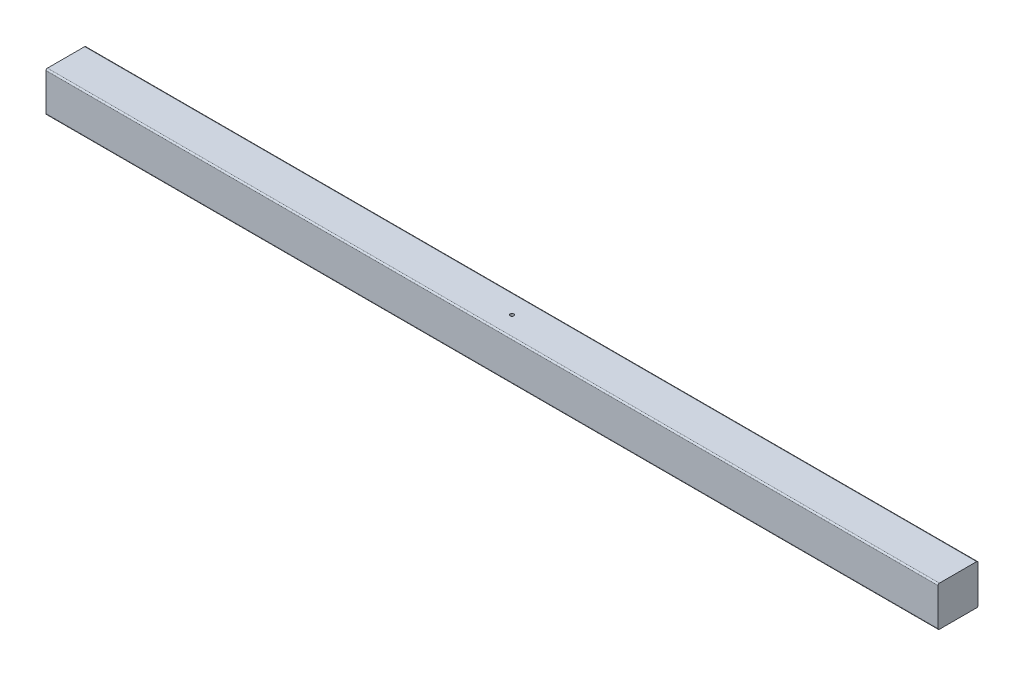
ISO-10303-21;
HEADER;
FILE_DESCRIPTION(('STEP AP214'),'2;1');
FILE_NAME('part.step','',(''),(''),'','','');
FILE_SCHEMA(('AUTOMOTIVE_DESIGN { 1 0 10303 214 1 1 1 1 }'));
ENDSEC;
DATA;
#1=APPLICATION_CONTEXT('core data for automotive mechanical design processes');
#2=APPLICATION_PROTOCOL_DEFINITION('international standard','automotive_design',2000,#1);
#3=PRODUCT_CONTEXT('',#1,'mechanical');
#4=PRODUCT('Part','Part','',(#3));
#5=PRODUCT_RELATED_PRODUCT_CATEGORY('part','',(#4));
#6=PRODUCT_DEFINITION_FORMATION('','',#4);
#7=PRODUCT_DEFINITION_CONTEXT('part definition',#1,'design');
#8=PRODUCT_DEFINITION('design','',#6,#7);
#9=PRODUCT_DEFINITION_SHAPE('','',#8);
#10=(LENGTH_UNIT() NAMED_UNIT(*) SI_UNIT(.MILLI.,.METRE.));
#11=(NAMED_UNIT(*) PLANE_ANGLE_UNIT() SI_UNIT($,.RADIAN.));
#12=(NAMED_UNIT(*) SI_UNIT($,.STERADIAN.) SOLID_ANGLE_UNIT());
#13=UNCERTAINTY_MEASURE_WITH_UNIT(LENGTH_MEASURE(1.E-05),#10,'distance_accuracy_value','');
#14=(GEOMETRIC_REPRESENTATION_CONTEXT(3) GLOBAL_UNCERTAINTY_ASSIGNED_CONTEXT((#13)) GLOBAL_UNIT_ASSIGNED_CONTEXT((#10,
#11,#12)) REPRESENTATION_CONTEXT('',''));
#15=CARTESIAN_POINT('',(0.,0.,0.));
#16=DIRECTION('',(0.,0.,1.));
#17=DIRECTION('',(1.,0.,0.));
#18=AXIS2_PLACEMENT_3D('',#15,#16,#17);
#19=CARTESIAN_POINT('',(1981.2,-44.45,-44.45));
#20=DIRECTION('',(0.,0.,1.));
#21=DIRECTION('',(1.,0.,0.));
#22=AXIS2_PLACEMENT_3D('',#19,#20,#21);
#23=PLANE('',#22);
#24=DIRECTION('',(0.,1.,0.));
#25=VECTOR('',#24,1.);
#26=CARTESIAN_POINT('',(1981.2,-44.45,-44.45));
#27=LINE('',#26,#25);
#28=CARTESIAN_POINT('',(1981.2,-41.275,-44.45));
#29=VERTEX_POINT('',#28);
#30=CARTESIAN_POINT('',(1981.2,41.275,-44.45));
#31=VERTEX_POINT('',#30);
#32=EDGE_CURVE('E117',#29,#31,#27,.T.);
#33=ORIENTED_EDGE('',*,*,#32,.F.);
#34=DIRECTION('',(-1.,0.,0.));
#35=VECTOR('',#34,1.);
#36=CARTESIAN_POINT('',(1981.2,-41.275,-44.45));
#37=LINE('',#36,#35);
#38=CARTESIAN_POINT('',(0.,-41.275,-44.45));
#39=VERTEX_POINT('',#38);
#40=EDGE_CURVE('E102',#29,#39,#37,.T.);
#41=ORIENTED_EDGE('',*,*,#40,.T.);
#42=DIRECTION('',(0.,1.,0.));
#43=VECTOR('',#42,1.);
#44=CARTESIAN_POINT('',(0.,-44.45,-44.45));
#45=LINE('',#44,#43);
#46=CARTESIAN_POINT('',(0.,41.275,-44.45));
#47=VERTEX_POINT('',#46);
#48=EDGE_CURVE('E114',#39,#47,#45,.T.);
#49=ORIENTED_EDGE('',*,*,#48,.T.);
#50=DIRECTION('',(-1.,0.,0.));
#51=VECTOR('',#50,1.);
#52=CARTESIAN_POINT('',(1981.2,41.275,-44.45));
#53=LINE('',#52,#51);
#54=EDGE_CURVE('E119',#47,#31,#53,.F.);
#55=ORIENTED_EDGE('',*,*,#54,.T.);
#56=EDGE_LOOP('',(#33,#41,#49,#55));
#57=FACE_BOUND('',#56,.T.);
#58=ADVANCED_FACE('F33',(#57),#23,.F.);
#59=CARTESIAN_POINT('',(1981.2,44.45,44.45));
#60=DIRECTION('',(0.,-1.,0.));
#61=DIRECTION('',(0.,0.,-1.));
#62=AXIS2_PLACEMENT_3D('',#59,#60,#61);
#63=PLANE('',#62);
#64=CARTESIAN_POINT('',(990.6,44.45,0.));
#65=DIRECTION('',(0.,1.,0.));
#66=DIRECTION('',(0.,0.,1.));
#67=AXIS2_PLACEMENT_3D('',#64,#65,#66);
#68=CIRCLE('',#67,3.96874999999997);
#69=CARTESIAN_POINT('',(990.6,44.45,3.96874999999997));
#70=VERTEX_POINT('',#69);
#71=EDGE_CURVE('E130',#70,#70,#68,.T.);
#72=ORIENTED_EDGE('',*,*,#71,.F.);
#73=EDGE_LOOP('',(#72));
#74=FACE_BOUND('',#73,.T.);
#75=DIRECTION('',(0.,0.,1.));
#76=VECTOR('',#75,1.);
#77=CARTESIAN_POINT('',(1981.2,44.45,44.45));
#78=LINE('',#77,#76);
#79=CARTESIAN_POINT('',(1981.2,44.45,-41.275));
#80=VERTEX_POINT('',#79);
#81=CARTESIAN_POINT('',(1981.2,44.45,41.275));
#82=VERTEX_POINT('',#81);
#83=EDGE_CURVE('E172',#80,#82,#78,.T.);
#84=ORIENTED_EDGE('',*,*,#83,.F.);
#85=DIRECTION('',(-1.,0.,0.));
#86=VECTOR('',#85,1.);
#87=CARTESIAN_POINT('',(1981.2,44.45,-41.275));
#88=LINE('',#87,#86);
#89=CARTESIAN_POINT('',(0.,44.45,-41.275));
#90=VERTEX_POINT('',#89);
#91=EDGE_CURVE('E156',#80,#90,#88,.T.);
#92=ORIENTED_EDGE('',*,*,#91,.T.);
#93=DIRECTION('',(0.,0.,1.));
#94=VECTOR('',#93,1.);
#95=CARTESIAN_POINT('',(0.,44.45,44.45));
#96=LINE('',#95,#94);
#97=CARTESIAN_POINT('',(0.,44.45,41.275));
#98=VERTEX_POINT('',#97);
#99=EDGE_CURVE('E123',#90,#98,#96,.T.);
#100=ORIENTED_EDGE('',*,*,#99,.T.);
#101=DIRECTION('',(-1.,0.,0.));
#102=VECTOR('',#101,1.);
#103=CARTESIAN_POINT('',(1981.2,44.45,41.275));
#104=LINE('',#103,#102);
#105=EDGE_CURVE('E154',#98,#82,#104,.F.);
#106=ORIENTED_EDGE('',*,*,#105,.T.);
#107=EDGE_LOOP('',(#84,#92,#100,#106));
#108=FACE_BOUND('',#107,.T.);
#109=ADVANCED_FACE('F181',(#74,#108),#63,.F.);
#110=CARTESIAN_POINT('',(1981.2,-44.45,44.45));
#111=DIRECTION('',(0.,0.,-1.));
#112=DIRECTION('',(-1.,0.,0.));
#113=AXIS2_PLACEMENT_3D('',#110,#111,#112);
#114=PLANE('',#113);
#115=DIRECTION('',(0.,-1.,0.));
#116=VECTOR('',#115,1.);
#117=CARTESIAN_POINT('',(0.,-44.45,44.45));
#118=LINE('',#117,#116);
#119=CARTESIAN_POINT('',(0.,41.275,44.45));
#120=VERTEX_POINT('',#119);
#121=CARTESIAN_POINT('',(0.,-41.275,44.45));
#122=VERTEX_POINT('',#121);
#123=EDGE_CURVE('E127',#120,#122,#118,.T.);
#124=ORIENTED_EDGE('',*,*,#123,.T.);
#125=DIRECTION('',(-1.,0.,0.));
#126=VECTOR('',#125,1.);
#127=CARTESIAN_POINT('',(1981.2,-41.275,44.45));
#128=LINE('',#127,#126);
#129=CARTESIAN_POINT('',(1981.2,-41.275,44.45));
#130=VERTEX_POINT('',#129);
#131=EDGE_CURVE('E11',#122,#130,#128,.F.);
#132=ORIENTED_EDGE('',*,*,#131,.T.);
#133=DIRECTION('',(0.,-1.,0.));
#134=VECTOR('',#133,1.);
#135=CARTESIAN_POINT('',(1981.2,-44.45,44.45));
#136=LINE('',#135,#134);
#137=CARTESIAN_POINT('',(1981.2,41.275,44.45));
#138=VERTEX_POINT('',#137);
#139=EDGE_CURVE('E162',#138,#130,#136,.T.);
#140=ORIENTED_EDGE('',*,*,#139,.F.);
#141=DIRECTION('',(-1.,0.,0.));
#142=VECTOR('',#141,1.);
#143=CARTESIAN_POINT('',(1981.2,41.275,44.45));
#144=LINE('',#143,#142);
#145=EDGE_CURVE('E41',#138,#120,#144,.T.);
#146=ORIENTED_EDGE('',*,*,#145,.T.);
#147=EDGE_LOOP('',(#124,#132,#140,#146));
#148=FACE_BOUND('',#147,.T.);
#149=ADVANCED_FACE('F161',(#148),#114,.F.);
#150=CARTESIAN_POINT('',(1981.2,-44.45,44.45));
#151=DIRECTION('',(0.,1.,0.));
#152=DIRECTION('',(0.,0.,1.));
#153=AXIS2_PLACEMENT_3D('',#150,#151,#152);
#154=PLANE('',#153);
#155=CARTESIAN_POINT('',(990.6,-44.45,0.));
#156=DIRECTION('',(0.,1.,0.));
#157=DIRECTION('',(0.,0.,1.));
#158=AXIS2_PLACEMENT_3D('',#155,#156,#157);
#159=CIRCLE('',#158,3.96874999999997);
#160=CARTESIAN_POINT('',(990.6,-44.45,3.96874999999997));
#161=VERTEX_POINT('',#160);
#162=EDGE_CURVE('E124',#161,#161,#159,.T.);
#163=ORIENTED_EDGE('',*,*,#162,.T.);
#164=EDGE_LOOP('',(#163));
#165=FACE_BOUND('',#164,.T.);
#166=DIRECTION('',(0.,0.,-1.));
#167=VECTOR('',#166,1.);
#168=CARTESIAN_POINT('',(0.,-44.45,44.45));
#169=LINE('',#168,#167);
#170=CARTESIAN_POINT('',(0.,-44.45,41.275));
#171=VERTEX_POINT('',#170);
#172=CARTESIAN_POINT('',(0.,-44.45,-41.275));
#173=VERTEX_POINT('',#172);
#174=EDGE_CURVE('E137',#171,#173,#169,.T.);
#175=ORIENTED_EDGE('',*,*,#174,.T.);
#176=DIRECTION('',(-1.,0.,0.));
#177=VECTOR('',#176,1.);
#178=CARTESIAN_POINT('',(1981.2,-44.45,-41.275));
#179=LINE('',#178,#177);
#180=CARTESIAN_POINT('',(1981.2,-44.45,-41.275));
#181=VERTEX_POINT('',#180);
#182=EDGE_CURVE('E103',#173,#181,#179,.F.);
#183=ORIENTED_EDGE('',*,*,#182,.T.);
#184=DIRECTION('',(0.,0.,-1.));
#185=VECTOR('',#184,1.);
#186=CARTESIAN_POINT('',(1981.2,-44.45,44.45));
#187=LINE('',#186,#185);
#188=CARTESIAN_POINT('',(1981.2,-44.45,41.275));
#189=VERTEX_POINT('',#188);
#190=EDGE_CURVE('E133',#189,#181,#187,.T.);
#191=ORIENTED_EDGE('',*,*,#190,.F.);
#192=DIRECTION('',(-1.,0.,0.));
#193=VECTOR('',#192,1.);
#194=CARTESIAN_POINT('',(1981.2,-44.45,41.275));
#195=LINE('',#194,#193);
#196=EDGE_CURVE('E108',#189,#171,#195,.T.);
#197=ORIENTED_EDGE('',*,*,#196,.T.);
#198=EDGE_LOOP('',(#175,#183,#191,#197));
#199=FACE_BOUND('',#198,.T.);
#200=ADVANCED_FACE('F170',(#165,#199),#154,.F.);
#201=CARTESIAN_POINT('',(1981.2,0.,0.));
#202=DIRECTION('',(-1.,0.,0.));
#203=DIRECTION('',(0.,0.,1.));
#204=AXIS2_PLACEMENT_3D('',#201,#202,#203);
#205=PLANE('',#204);
#206=ORIENTED_EDGE('',*,*,#190,.T.);
#207=CARTESIAN_POINT('',(1981.2,-41.275,-41.275));
#208=DIRECTION('',(-1.,0.,0.));
#209=DIRECTION('',(0.,0.,1.));
#210=AXIS2_PLACEMENT_3D('',#207,#208,#209);
#211=CIRCLE('',#210,3.175);
#212=EDGE_CURVE('E152',#181,#29,#211,.F.);
#213=ORIENTED_EDGE('',*,*,#212,.T.);
#214=ORIENTED_EDGE('',*,*,#32,.T.);
#215=CARTESIAN_POINT('',(1981.2,41.275,-41.275));
#216=DIRECTION('',(-1.,0.,0.));
#217=DIRECTION('',(0.,0.,1.));
#218=AXIS2_PLACEMENT_3D('',#215,#216,#217);
#219=CIRCLE('',#218,3.175);
#220=EDGE_CURVE('E150',#31,#80,#219,.F.);
#221=ORIENTED_EDGE('',*,*,#220,.T.);
#222=ORIENTED_EDGE('',*,*,#83,.T.);
#223=CARTESIAN_POINT('',(1981.2,41.275,41.275));
#224=DIRECTION('',(-1.,0.,0.));
#225=DIRECTION('',(0.,0.,1.));
#226=AXIS2_PLACEMENT_3D('',#223,#224,#225);
#227=CIRCLE('',#226,3.175);
#228=EDGE_CURVE('E53',#82,#138,#227,.F.);
#229=ORIENTED_EDGE('',*,*,#228,.T.);
#230=ORIENTED_EDGE('',*,*,#139,.T.);
#231=CARTESIAN_POINT('',(1981.2,-41.275,41.275));
#232=DIRECTION('',(-1.,0.,0.));
#233=DIRECTION('',(0.,0.,1.));
#234=AXIS2_PLACEMENT_3D('',#231,#232,#233);
#235=CIRCLE('',#234,3.175);
#236=EDGE_CURVE('E148',#130,#189,#235,.F.);
#237=ORIENTED_EDGE('',*,*,#236,.T.);
#238=EDGE_LOOP('',(#206,#213,#214,#221,#222,#229,#230,#237));
#239=FACE_BOUND('',#238,.T.);
#240=ADVANCED_FACE('F191',(#239),#205,.F.);
#241=CARTESIAN_POINT('',(0.,0.,0.));
#242=DIRECTION('',(-1.,0.,0.));
#243=DIRECTION('',(0.,0.,1.));
#244=AXIS2_PLACEMENT_3D('',#241,#242,#243);
#245=PLANE('',#244);
#246=ORIENTED_EDGE('',*,*,#48,.F.);
#247=CARTESIAN_POINT('',(0.,-41.275,-41.275));
#248=DIRECTION('',(-1.,0.,0.));
#249=DIRECTION('',(0.,0.,1.));
#250=AXIS2_PLACEMENT_3D('',#247,#248,#249);
#251=CIRCLE('',#250,3.175);
#252=EDGE_CURVE('E98',#39,#173,#251,.T.);
#253=ORIENTED_EDGE('',*,*,#252,.T.);
#254=ORIENTED_EDGE('',*,*,#174,.F.);
#255=CARTESIAN_POINT('',(0.,-41.275,41.275));
#256=DIRECTION('',(-1.,0.,0.));
#257=DIRECTION('',(0.,0.,1.));
#258=AXIS2_PLACEMENT_3D('',#255,#256,#257);
#259=CIRCLE('',#258,3.175);
#260=EDGE_CURVE('E141',#171,#122,#259,.T.);
#261=ORIENTED_EDGE('',*,*,#260,.T.);
#262=ORIENTED_EDGE('',*,*,#123,.F.);
#263=CARTESIAN_POINT('',(0.,41.275,41.275));
#264=DIRECTION('',(-1.,0.,0.));
#265=DIRECTION('',(0.,0.,1.));
#266=AXIS2_PLACEMENT_3D('',#263,#264,#265);
#267=CIRCLE('',#266,3.175);
#268=EDGE_CURVE('E118',#120,#98,#267,.T.);
#269=ORIENTED_EDGE('',*,*,#268,.T.);
#270=ORIENTED_EDGE('',*,*,#99,.F.);
#271=CARTESIAN_POINT('',(0.,41.275,-41.275));
#272=DIRECTION('',(-1.,0.,0.));
#273=DIRECTION('',(0.,0.,1.));
#274=AXIS2_PLACEMENT_3D('',#271,#272,#273);
#275=CIRCLE('',#274,3.175);
#276=EDGE_CURVE('E109',#90,#47,#275,.T.);
#277=ORIENTED_EDGE('',*,*,#276,.T.);
#278=EDGE_LOOP('',(#246,#253,#254,#261,#262,#269,#270,#277));
#279=FACE_BOUND('',#278,.T.);
#280=ADVANCED_FACE('F121',(#279),#245,.T.);
#281=CARTESIAN_POINT('',(1981.2,-41.275,-41.275));
#282=DIRECTION('',(-1.,0.,0.));
#283=DIRECTION('',(0.,0.,1.));
#284=AXIS2_PLACEMENT_3D('',#281,#282,#283);
#285=CYLINDRICAL_SURFACE('',#284,3.175);
#286=ORIENTED_EDGE('',*,*,#212,.F.);
#287=ORIENTED_EDGE('',*,*,#182,.F.);
#288=ORIENTED_EDGE('',*,*,#252,.F.);
#289=ORIENTED_EDGE('',*,*,#40,.F.);
#290=EDGE_LOOP('',(#286,#287,#288,#289));
#291=FACE_BOUND('',#290,.T.);
#292=ADVANCED_FACE('F101',(#291),#285,.T.);
#293=CARTESIAN_POINT('',(1981.2,41.275,-41.275));
#294=DIRECTION('',(-1.,0.,0.));
#295=DIRECTION('',(0.,0.,1.));
#296=AXIS2_PLACEMENT_3D('',#293,#294,#295);
#297=CYLINDRICAL_SURFACE('',#296,3.175);
#298=ORIENTED_EDGE('',*,*,#220,.F.);
#299=ORIENTED_EDGE('',*,*,#54,.F.);
#300=ORIENTED_EDGE('',*,*,#276,.F.);
#301=ORIENTED_EDGE('',*,*,#91,.F.);
#302=EDGE_LOOP('',(#298,#299,#300,#301));
#303=FACE_BOUND('',#302,.T.);
#304=ADVANCED_FACE('F190',(#303),#297,.T.);
#305=CARTESIAN_POINT('',(1981.2,-41.275,41.275));
#306=DIRECTION('',(-1.,0.,0.));
#307=DIRECTION('',(0.,0.,1.));
#308=AXIS2_PLACEMENT_3D('',#305,#306,#307);
#309=CYLINDRICAL_SURFACE('',#308,3.175);
#310=ORIENTED_EDGE('',*,*,#236,.F.);
#311=ORIENTED_EDGE('',*,*,#131,.F.);
#312=ORIENTED_EDGE('',*,*,#260,.F.);
#313=ORIENTED_EDGE('',*,*,#196,.F.);
#314=EDGE_LOOP('',(#310,#311,#312,#313));
#315=FACE_BOUND('',#314,.T.);
#316=ADVANCED_FACE('F167',(#315),#309,.T.);
#317=CARTESIAN_POINT('',(1981.2,41.275,41.275));
#318=DIRECTION('',(-1.,0.,0.));
#319=DIRECTION('',(0.,0.,1.));
#320=AXIS2_PLACEMENT_3D('',#317,#318,#319);
#321=CYLINDRICAL_SURFACE('',#320,3.175);
#322=ORIENTED_EDGE('',*,*,#228,.F.);
#323=ORIENTED_EDGE('',*,*,#105,.F.);
#324=ORIENTED_EDGE('',*,*,#268,.F.);
#325=ORIENTED_EDGE('',*,*,#145,.F.);
#326=EDGE_LOOP('',(#322,#323,#324,#325));
#327=FACE_BOUND('',#326,.T.);
#328=ADVANCED_FACE('F35',(#327),#321,.T.);
#329=CARTESIAN_POINT('',(990.6,44.45,0.));
#330=DIRECTION('',(0.,1.,0.));
#331=DIRECTION('',(0.,0.,1.));
#332=AXIS2_PLACEMENT_3D('',#329,#330,#331);
#333=CYLINDRICAL_SURFACE('',#332,3.96874999999997);
#334=ORIENTED_EDGE('',*,*,#162,.F.);
#335=EDGE_LOOP('',(#334));
#336=FACE_BOUND('',#335,.T.);
#337=ORIENTED_EDGE('',*,*,#71,.T.);
#338=EDGE_LOOP('',(#337));
#339=FACE_BOUND('',#338,.T.);
#340=ADVANCED_FACE('F179',(#336,#339),#333,.F.);
#341=CLOSED_SHELL('',(#58,#109,#149,#200,#240,#280,#292,#304,#316,#328,#340));
#342=MANIFOLD_SOLID_BREP('B2',#341);
#343=ADVANCED_BREP_SHAPE_REPRESENTATION('',(#18,#342),#14);
#344=SHAPE_DEFINITION_REPRESENTATION(#9,#343);
ENDSEC;
END-ISO-10303-21;
